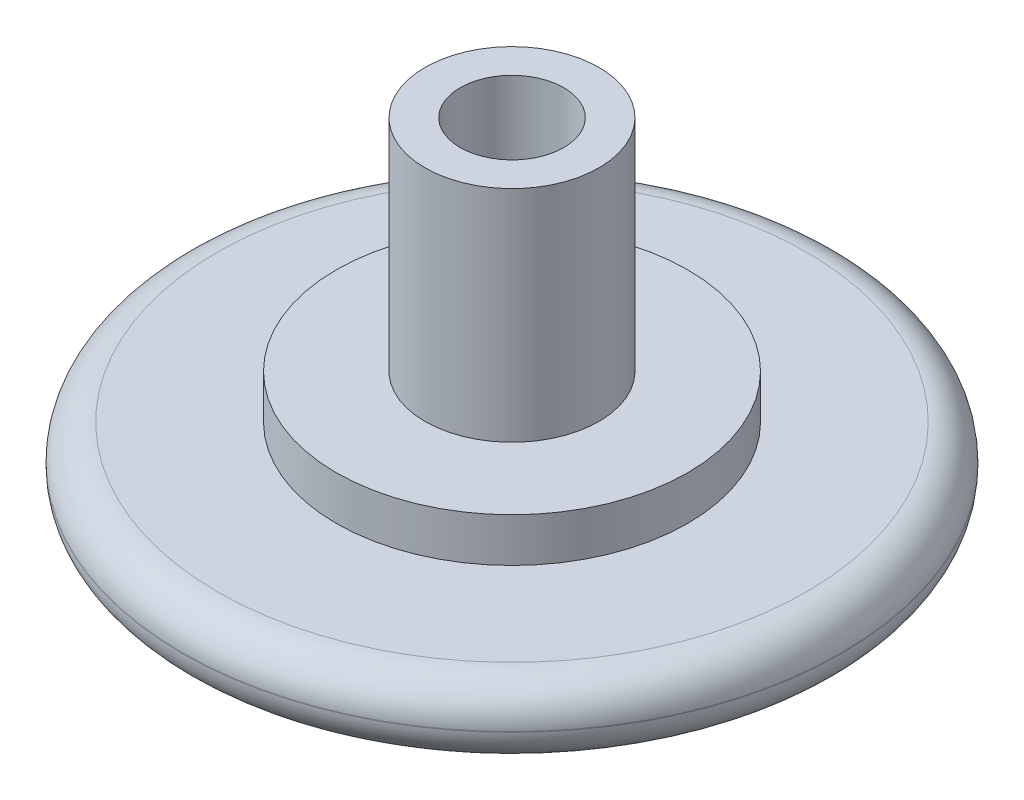
ISO-10303-21;
HEADER;
FILE_DESCRIPTION(('STEP AP214'),'2;1');
FILE_NAME('part.step','',(''),(''),'','','');
FILE_SCHEMA(('AUTOMOTIVE_DESIGN { 1 0 10303 214 1 1 1 1 }'));
ENDSEC;
DATA;
#1=APPLICATION_CONTEXT('core data for automotive mechanical design processes');
#2=APPLICATION_PROTOCOL_DEFINITION('international standard','automotive_design',2000,#1);
#3=PRODUCT_CONTEXT('',#1,'mechanical');
#4=PRODUCT('Part','Part','',(#3));
#5=PRODUCT_RELATED_PRODUCT_CATEGORY('part','',(#4));
#6=PRODUCT_DEFINITION_FORMATION('','',#4);
#7=PRODUCT_DEFINITION_CONTEXT('part definition',#1,'design');
#8=PRODUCT_DEFINITION('design','',#6,#7);
#9=PRODUCT_DEFINITION_SHAPE('','',#8);
#10=(LENGTH_UNIT() NAMED_UNIT(*) SI_UNIT(.MILLI.,.METRE.));
#11=(NAMED_UNIT(*) PLANE_ANGLE_UNIT() SI_UNIT($,.RADIAN.));
#12=(NAMED_UNIT(*) SI_UNIT($,.STERADIAN.) SOLID_ANGLE_UNIT());
#13=UNCERTAINTY_MEASURE_WITH_UNIT(LENGTH_MEASURE(1.E-05),#10,'distance_accuracy_value','');
#14=(GEOMETRIC_REPRESENTATION_CONTEXT(3) GLOBAL_UNCERTAINTY_ASSIGNED_CONTEXT((#13)) GLOBAL_UNIT_ASSIGNED_CONTEXT((#10,
#11,#12)) REPRESENTATION_CONTEXT('',''));
#15=CARTESIAN_POINT('',(0.,0.,0.));
#16=DIRECTION('',(0.,0.,1.));
#17=DIRECTION('',(1.,0.,0.));
#18=AXIS2_PLACEMENT_3D('',#15,#16,#17);
#19=CARTESIAN_POINT('',(0.,2.,0.));
#20=DIRECTION('',(0.,-1.,0.));
#21=DIRECTION('',(0.,0.,-1.));
#22=AXIS2_PLACEMENT_3D('',#19,#20,#21);
#23=CYLINDRICAL_SURFACE('',#22,7.5);
#24=CARTESIAN_POINT('',(0.,1.18428420386844,0.));
#25=DIRECTION('',(0.,-1.,0.));
#26=DIRECTION('',(0.,0.,-1.));
#27=AXIS2_PLACEMENT_3D('',#24,#25,#26);
#28=CIRCLE('',#27,7.5);
#29=CARTESIAN_POINT('',(0.,1.18428420386844,-7.5));
#30=VERTEX_POINT('',#29);
#31=EDGE_CURVE('E41',#30,#30,#28,.F.);
#32=ORIENTED_EDGE('',*,*,#31,.T.);
#33=EDGE_LOOP('',(#32));
#34=FACE_BOUND('',#33,.T.);
#35=CARTESIAN_POINT('',(0.,1.2,0.));
#36=DIRECTION('',(0.,1.,0.));
#37=DIRECTION('',(0.,0.,1.));
#38=AXIS2_PLACEMENT_3D('',#35,#36,#37);
#39=CIRCLE('',#38,7.5);
#40=CARTESIAN_POINT('',(0.,1.2,7.5));
#41=VERTEX_POINT('',#40);
#42=EDGE_CURVE('E45',#41,#41,#39,.F.);
#43=ORIENTED_EDGE('',*,*,#42,.T.);
#44=EDGE_LOOP('',(#43));
#45=FACE_BOUND('',#44,.T.);
#46=ADVANCED_FACE('F30',(#34,#45),#23,.T.);
#47=CARTESIAN_POINT('',(0.,2.,0.));
#48=DIRECTION('',(0.,1.,0.));
#49=DIRECTION('',(0.,0.,1.));
#50=AXIS2_PLACEMENT_3D('',#47,#48,#49);
#51=PLANE('',#50);
#52=CARTESIAN_POINT('',(0.,2.,0.));
#53=DIRECTION('',(0.,1.,0.));
#54=DIRECTION('',(0.,0.,1.));
#55=AXIS2_PLACEMENT_3D('',#52,#53,#54);
#56=CIRCLE('',#55,6.7);
#57=CARTESIAN_POINT('',(0.,2.,6.7));
#58=VERTEX_POINT('',#57);
#59=EDGE_CURVE('E10',#58,#58,#56,.T.);
#60=ORIENTED_EDGE('',*,*,#59,.T.);
#61=EDGE_LOOP('',(#60));
#62=FACE_BOUND('',#61,.T.);
#63=CARTESIAN_POINT('',(0.,2.,0.));
#64=DIRECTION('',(0.,1.,0.));
#65=DIRECTION('',(0.,0.,1.));
#66=AXIS2_PLACEMENT_3D('',#63,#64,#65);
#67=CIRCLE('',#66,4.);
#68=CARTESIAN_POINT('',(0.,2.,4.));
#69=VERTEX_POINT('',#68);
#70=EDGE_CURVE('E54',#69,#69,#67,.T.);
#71=ORIENTED_EDGE('',*,*,#70,.F.);
#72=EDGE_LOOP('',(#71));
#73=FACE_BOUND('',#72,.T.);
#74=ADVANCED_FACE('F90',(#62,#73),#51,.T.);
#75=CARTESIAN_POINT('',(0.,3.,0.));
#76=DIRECTION('',(0.,-1.,0.));
#77=DIRECTION('',(0.,0.,-1.));
#78=AXIS2_PLACEMENT_3D('',#75,#76,#77);
#79=CYLINDRICAL_SURFACE('',#78,4.);
#80=CARTESIAN_POINT('',(0.,3.,0.));
#81=DIRECTION('',(0.,1.,0.));
#82=DIRECTION('',(0.,0.,1.));
#83=AXIS2_PLACEMENT_3D('',#80,#81,#82);
#84=CIRCLE('',#83,4.);
#85=CARTESIAN_POINT('',(0.,3.,4.));
#86=VERTEX_POINT('',#85);
#87=EDGE_CURVE('E53',#86,#86,#84,.T.);
#88=ORIENTED_EDGE('',*,*,#87,.F.);
#89=EDGE_LOOP('',(#88));
#90=FACE_BOUND('',#89,.T.);
#91=ORIENTED_EDGE('',*,*,#70,.T.);
#92=EDGE_LOOP('',(#91));
#93=FACE_BOUND('',#92,.T.);
#94=ADVANCED_FACE('F96',(#90,#93),#79,.T.);
#95=CARTESIAN_POINT('',(0.,3.,0.));
#96=DIRECTION('',(0.,1.,0.));
#97=DIRECTION('',(0.,0.,1.));
#98=AXIS2_PLACEMENT_3D('',#95,#96,#97);
#99=PLANE('',#98);
#100=CARTESIAN_POINT('',(0.,3.,0.));
#101=DIRECTION('',(0.,1.,0.));
#102=DIRECTION('',(0.,0.,1.));
#103=AXIS2_PLACEMENT_3D('',#100,#101,#102);
#104=CIRCLE('',#103,1.98);
#105=CARTESIAN_POINT('',(0.,3.,1.98));
#106=VERTEX_POINT('',#105);
#107=EDGE_CURVE('E60',#106,#106,#104,.T.);
#108=ORIENTED_EDGE('',*,*,#107,.F.);
#109=EDGE_LOOP('',(#108));
#110=FACE_BOUND('',#109,.T.);
#111=ORIENTED_EDGE('',*,*,#87,.T.);
#112=EDGE_LOOP('',(#111));
#113=FACE_BOUND('',#112,.T.);
#114=ADVANCED_FACE('F87',(#110,#113),#99,.T.);
#115=CARTESIAN_POINT('',(0.,8.,0.));
#116=DIRECTION('',(0.,1.,0.));
#117=DIRECTION('',(0.,0.,1.));
#118=AXIS2_PLACEMENT_3D('',#115,#116,#117);
#119=PLANE('',#118);
#120=CARTESIAN_POINT('',(0.,8.,0.));
#121=DIRECTION('',(0.,1.,0.));
#122=DIRECTION('',(0.,0.,1.));
#123=AXIS2_PLACEMENT_3D('',#120,#121,#122);
#124=CIRCLE('',#123,1.98);
#125=CARTESIAN_POINT('',(0.,8.,1.98));
#126=VERTEX_POINT('',#125);
#127=EDGE_CURVE('E57',#126,#126,#124,.T.);
#128=ORIENTED_EDGE('',*,*,#127,.T.);
#129=EDGE_LOOP('',(#128));
#130=FACE_BOUND('',#129,.T.);
#131=CARTESIAN_POINT('',(0.,8.,0.));
#132=DIRECTION('',(0.,1.,0.));
#133=DIRECTION('',(0.,0.,1.));
#134=AXIS2_PLACEMENT_3D('',#131,#132,#133);
#135=CIRCLE('',#134,1.18);
#136=CARTESIAN_POINT('',(0.,8.,1.18));
#137=VERTEX_POINT('',#136);
#138=EDGE_CURVE('E63',#137,#137,#135,.T.);
#139=ORIENTED_EDGE('',*,*,#138,.F.);
#140=EDGE_LOOP('',(#139));
#141=FACE_BOUND('',#140,.T.);
#142=ADVANCED_FACE('F164',(#130,#141),#119,.T.);
#143=CARTESIAN_POINT('',(0.,8.,0.));
#144=DIRECTION('',(0.,-1.,0.));
#145=DIRECTION('',(0.,0.,-1.));
#146=AXIS2_PLACEMENT_3D('',#143,#144,#145);
#147=CYLINDRICAL_SURFACE('',#146,1.98);
#148=ORIENTED_EDGE('',*,*,#127,.F.);
#149=EDGE_LOOP('',(#148));
#150=FACE_BOUND('',#149,.T.);
#151=ORIENTED_EDGE('',*,*,#107,.T.);
#152=EDGE_LOOP('',(#151));
#153=FACE_BOUND('',#152,.T.);
#154=ADVANCED_FACE('F155',(#150,#153),#147,.T.);
#155=CARTESIAN_POINT('',(0.,8.,0.));
#156=DIRECTION('',(0.,-1.,0.));
#157=DIRECTION('',(0.,0.,-1.));
#158=AXIS2_PLACEMENT_3D('',#155,#156,#157);
#159=CYLINDRICAL_SURFACE('',#158,1.18);
#160=ORIENTED_EDGE('',*,*,#138,.T.);
#161=EDGE_LOOP('',(#160));
#162=FACE_BOUND('',#161,.T.);
#163=CARTESIAN_POINT('',(0.,3.,0.));
#164=DIRECTION('',(0.,1.,0.));
#165=DIRECTION('',(0.,0.,1.));
#166=AXIS2_PLACEMENT_3D('',#163,#164,#165);
#167=CIRCLE('',#166,1.18);
#168=CARTESIAN_POINT('',(0.,3.,1.18));
#169=VERTEX_POINT('',#168);
#170=EDGE_CURVE('E50',#169,#169,#167,.F.);
#171=ORIENTED_EDGE('',*,*,#170,.T.);
#172=EDGE_LOOP('',(#171));
#173=FACE_BOUND('',#172,.T.);
#174=ADVANCED_FACE('F84',(#162,#173),#159,.F.);
#175=ORIENTED_EDGE('',*,*,#170,.F.);
#176=EDGE_LOOP('',(#175));
#177=FACE_BOUND('',#176,.T.);
#178=ADVANCED_FACE('F76',(#177),#99,.T.);
#179=CARTESIAN_POINT('',(0.,0.999999999999995,0.));
#180=DIRECTION('',(0.,-1.,0.));
#181=DIRECTION('',(0.,0.,-1.));
#182=AXIS2_PLACEMENT_3D('',#179,#180,#181);
#183=PLANE('',#182);
#184=CARTESIAN_POINT('',(0.,0.99999999999999,0.));
#185=DIRECTION('',(0.,1.,0.));
#186=DIRECTION('',(0.,0.,1.));
#187=AXIS2_PLACEMENT_3D('',#184,#185,#186);
#188=CIRCLE('',#187,3.);
#189=CARTESIAN_POINT('',(0.,0.99999999999999,3.));
#190=VERTEX_POINT('',#189);
#191=EDGE_CURVE('E68',#190,#190,#188,.T.);
#192=ORIENTED_EDGE('',*,*,#191,.F.);
#193=EDGE_LOOP('',(#192));
#194=FACE_BOUND('',#193,.T.);
#195=ADVANCED_FACE('F74',(#194),#183,.T.);
#196=CARTESIAN_POINT('',(0.,-9.6250000000003,0.));
#197=DIRECTION('',(0.,1.,0.));
#198=DIRECTION('',(0.,0.,1.));
#199=AXIS2_PLACEMENT_3D('',#196,#197,#198);
#200=DEGENERATE_TOROIDAL_SURFACE('',#199,2.99999999999997,10.6250000000003,.T.);
#201=CARTESIAN_POINT('',(0.,0.427397782591009,0.));
#202=DIRECTION('',(0.,-1.,0.));
#203=DIRECTION('',(0.,0.,-1.));
#204=AXIS2_PLACEMENT_3D('',#201,#202,#203);
#205=CIRCLE('',#204,6.44091903719913);
#206=CARTESIAN_POINT('',(0.,0.427397782591009,-6.44091903719913));
#207=VERTEX_POINT('',#206);
#208=EDGE_CURVE('E37',#207,#207,#205,.T.);
#209=ORIENTED_EDGE('',*,*,#208,.T.);
#210=EDGE_LOOP('',(#209));
#211=FACE_BOUND('',#210,.T.);
#212=ORIENTED_EDGE('',*,*,#191,.T.);
#213=EDGE_LOOP('',(#212));
#214=FACE_BOUND('',#213,.T.);
#215=ADVANCED_FACE('F72',(#211,#214),#200,.F.);
#216=CARTESIAN_POINT('',(0.,1.18428420386844,0.));
#217=DIRECTION('',(0.,-1.,0.));
#218=DIRECTION('',(0.,0.,-1.));
#219=AXIS2_PLACEMENT_3D('',#216,#217,#218);
#220=TOROIDAL_SURFACE('',#219,6.7,0.8);
#221=ORIENTED_EDGE('',*,*,#208,.F.);
#222=EDGE_LOOP('',(#221));
#223=FACE_BOUND('',#222,.T.);
#224=ORIENTED_EDGE('',*,*,#31,.F.);
#225=EDGE_LOOP('',(#224));
#226=FACE_BOUND('',#225,.T.);
#227=ADVANCED_FACE('F82',(#223,#226),#220,.T.);
#228=CARTESIAN_POINT('',(0.,1.2,0.));
#229=DIRECTION('',(0.,1.,0.));
#230=DIRECTION('',(0.,0.,1.));
#231=AXIS2_PLACEMENT_3D('',#228,#229,#230);
#232=TOROIDAL_SURFACE('',#231,6.7,0.8);
#233=ORIENTED_EDGE('',*,*,#42,.F.);
#234=EDGE_LOOP('',(#233));
#235=FACE_BOUND('',#234,.T.);
#236=ORIENTED_EDGE('',*,*,#59,.F.);
#237=EDGE_LOOP('',(#236));
#238=FACE_BOUND('',#237,.T.);
#239=ADVANCED_FACE('F32',(#235,#238),#232,.T.);
#240=CLOSED_SHELL('',(#46,#74,#94,#114,#142,#154,#174,#178,#195,#215,#227,#239));
#241=MANIFOLD_SOLID_BREP('B2',#240);
#242=ADVANCED_BREP_SHAPE_REPRESENTATION('',(#18,#241),#14);
#243=SHAPE_DEFINITION_REPRESENTATION(#9,#242);
ENDSEC;
END-ISO-10303-21;
